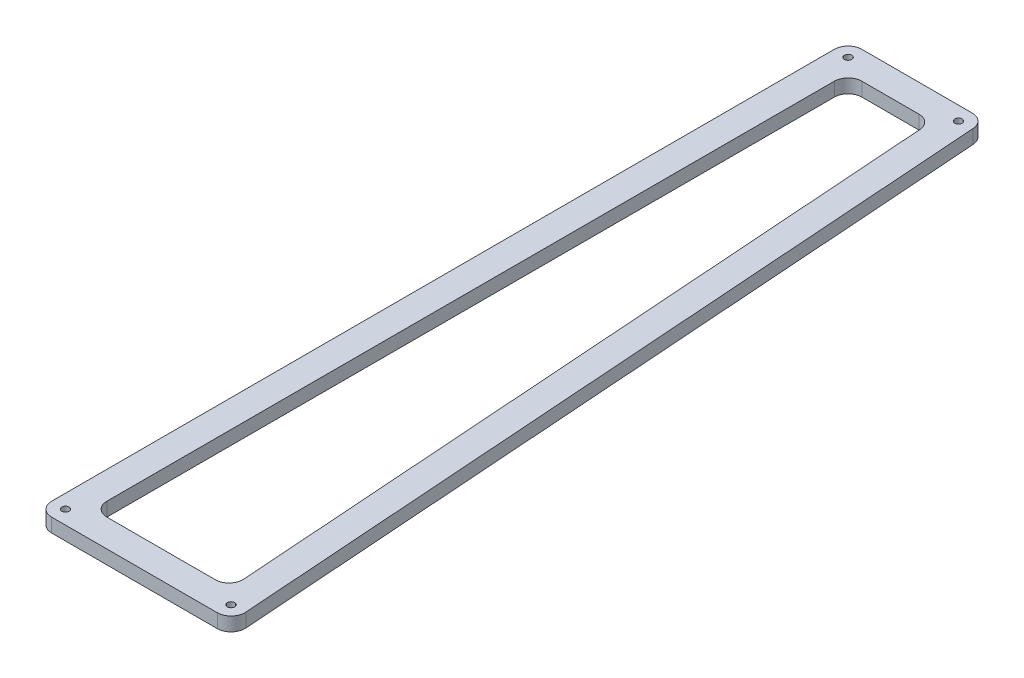
ISO-10303-21;
HEADER;
FILE_DESCRIPTION(('STEP AP214'),'2;1');
FILE_NAME('part.step','',(''),(''),'','','');
FILE_SCHEMA(('AUTOMOTIVE_DESIGN { 1 0 10303 214 1 1 1 1 }'));
ENDSEC;
DATA;
#1=APPLICATION_CONTEXT('core data for automotive mechanical design processes');
#2=APPLICATION_PROTOCOL_DEFINITION('international standard','automotive_design',2000,#1);
#3=PRODUCT_CONTEXT('',#1,'mechanical');
#4=PRODUCT('Part','Part','',(#3));
#5=PRODUCT_RELATED_PRODUCT_CATEGORY('part','',(#4));
#6=PRODUCT_DEFINITION_FORMATION('','',#4);
#7=PRODUCT_DEFINITION_CONTEXT('part definition',#1,'design');
#8=PRODUCT_DEFINITION('design','',#6,#7);
#9=PRODUCT_DEFINITION_SHAPE('','',#8);
#10=(LENGTH_UNIT() NAMED_UNIT(*) SI_UNIT(.MILLI.,.METRE.));
#11=(NAMED_UNIT(*) PLANE_ANGLE_UNIT() SI_UNIT($,.RADIAN.));
#12=(NAMED_UNIT(*) SI_UNIT($,.STERADIAN.) SOLID_ANGLE_UNIT());
#13=UNCERTAINTY_MEASURE_WITH_UNIT(LENGTH_MEASURE(1.E-05),#10,'distance_accuracy_value','');
#14=(GEOMETRIC_REPRESENTATION_CONTEXT(3) GLOBAL_UNCERTAINTY_ASSIGNED_CONTEXT((#13)) GLOBAL_UNIT_ASSIGNED_CONTEXT((#10,
#11,#12)) REPRESENTATION_CONTEXT('',''));
#15=CARTESIAN_POINT('',(0.,0.,0.));
#16=DIRECTION('',(0.,0.,1.));
#17=DIRECTION('',(1.,0.,0.));
#18=AXIS2_PLACEMENT_3D('',#15,#16,#17);
#19=CARTESIAN_POINT('',(0.,3.175,0.));
#20=DIRECTION('',(0.,1.,0.));
#21=DIRECTION('',(0.,0.,1.));
#22=AXIS2_PLACEMENT_3D('',#19,#20,#21);
#23=PLANE('',#22);
#24=CARTESIAN_POINT('',(38.1,3.175,0.));
#25=DIRECTION('',(0.,1.,0.));
#26=DIRECTION('',(0.,0.,1.));
#27=AXIS2_PLACEMENT_3D('',#24,#25,#26);
#28=CIRCLE('',#27,0.850899999999999);
#29=CARTESIAN_POINT('',(38.1,3.175,0.8509));
#30=VERTEX_POINT('',#29);
#31=EDGE_CURVE('E450',#30,#30,#28,.T.);
#32=ORIENTED_EDGE('',*,*,#31,.F.);
#33=EDGE_LOOP('',(#32));
#34=FACE_BOUND('',#33,.T.);
#35=CARTESIAN_POINT('',(0.,3.175,-180.086));
#36=DIRECTION('',(0.,1.,0.));
#37=DIRECTION('',(0.,0.,1.));
#38=AXIS2_PLACEMENT_3D('',#35,#36,#37);
#39=CIRCLE('',#38,0.850900000000004);
#40=CARTESIAN_POINT('',(0.,3.175,-179.2351));
#41=VERTEX_POINT('',#40);
#42=EDGE_CURVE('E207',#41,#41,#39,.T.);
#43=ORIENTED_EDGE('',*,*,#42,.F.);
#44=EDGE_LOOP('',(#43));
#45=FACE_BOUND('',#44,.T.);
#46=CARTESIAN_POINT('',(0.,3.175,0.));
#47=DIRECTION('',(0.,1.,0.));
#48=DIRECTION('',(0.,0.,1.));
#49=AXIS2_PLACEMENT_3D('',#46,#47,#48);
#50=CIRCLE('',#49,3.175);
#51=CARTESIAN_POINT('',(-3.17499999999998,3.175,0.));
#52=VERTEX_POINT('',#51);
#53=CARTESIAN_POINT('',(0.,3.175,3.175));
#54=VERTEX_POINT('',#53);
#55=EDGE_CURVE('E251',#52,#54,#50,.T.);
#56=ORIENTED_EDGE('',*,*,#55,.T.);
#57=DIRECTION('',(1.,0.,0.));
#58=VECTOR('',#57,1.);
#59=CARTESIAN_POINT('',(0.,3.175,3.175));
#60=LINE('',#59,#58);
#61=CARTESIAN_POINT('',(38.1,3.175,3.17500000000001));
#62=VERTEX_POINT('',#61);
#63=EDGE_CURVE('E255',#54,#62,#60,.T.);
#64=ORIENTED_EDGE('',*,*,#63,.T.);
#65=CARTESIAN_POINT('',(38.1,3.175,0.));
#66=DIRECTION('',(0.,1.,0.));
#67=DIRECTION('',(0.,0.,1.));
#68=AXIS2_PLACEMENT_3D('',#65,#66,#67);
#69=CIRCLE('',#68,3.17500000000001);
#70=CARTESIAN_POINT('',(41.2671341613275,3.175,-0.223352197554828));
#71=VERTEX_POINT('',#70);
#72=EDGE_CURVE('E259',#62,#71,#69,.T.);
#73=ORIENTED_EDGE('',*,*,#72,.T.);
#74=DIRECTION('',(-0.0703471488361664,0.,-0.997522570496839));
#75=VECTOR('',#74,1.);
#76=CARTESIAN_POINT('',(41.2671341613275,3.175,-0.223352197554828));
#77=LINE('',#76,#75);
#78=CARTESIAN_POINT('',(28.5671341613275,3.175,-180.309352197555));
#79=VERTEX_POINT('',#78);
#80=EDGE_CURVE('E262',#71,#79,#77,.T.);
#81=ORIENTED_EDGE('',*,*,#80,.T.);
#82=CARTESIAN_POINT('',(25.4,3.175,-180.086));
#83=DIRECTION('',(0.,1.,0.));
#84=DIRECTION('',(0.,0.,1.));
#85=AXIS2_PLACEMENT_3D('',#82,#83,#84);
#86=CIRCLE('',#85,3.17499999999999);
#87=CARTESIAN_POINT('',(25.4,3.175,-183.261));
#88=VERTEX_POINT('',#87);
#89=EDGE_CURVE('E265',#79,#88,#86,.T.);
#90=ORIENTED_EDGE('',*,*,#89,.T.);
#91=DIRECTION('',(-1.,0.,0.));
#92=VECTOR('',#91,1.);
#93=CARTESIAN_POINT('',(25.4,3.175,-183.261));
#94=LINE('',#93,#92);
#95=CARTESIAN_POINT('',(0.,3.175,-183.261));
#96=VERTEX_POINT('',#95);
#97=EDGE_CURVE('E268',#88,#96,#94,.T.);
#98=ORIENTED_EDGE('',*,*,#97,.T.);
#99=CARTESIAN_POINT('',(0.,3.175,-180.086));
#100=DIRECTION('',(0.,1.,0.));
#101=DIRECTION('',(0.,0.,-1.));
#102=AXIS2_PLACEMENT_3D('',#99,#100,#101);
#103=CIRCLE('',#102,3.17500000000001);
#104=CARTESIAN_POINT('',(-3.175,3.175,-180.086));
#105=VERTEX_POINT('',#104);
#106=EDGE_CURVE('E271',#96,#105,#103,.T.);
#107=ORIENTED_EDGE('',*,*,#106,.T.);
#108=DIRECTION('',(0.,0.,1.));
#109=VECTOR('',#108,1.);
#110=CARTESIAN_POINT('',(-3.175,3.175,-180.086));
#111=LINE('',#110,#109);
#112=EDGE_CURVE('E274',#105,#52,#111,.T.);
#113=ORIENTED_EDGE('',*,*,#112,.T.);
#114=EDGE_LOOP('',(#56,#64,#73,#81,#90,#98,#107,#113));
#115=FACE_BOUND('',#114,.T.);
#116=DIRECTION('',(1.,0.,0.));
#117=VECTOR('',#116,1.);
#118=CARTESIAN_POINT('',(6.35000000000008,3.175,-3.175));
#119=LINE('',#118,#117);
#120=CARTESIAN_POINT('',(6.35000000000008,3.175,-3.175));
#121=VERTEX_POINT('',#120);
#122=CARTESIAN_POINT('',(31.286415429453,3.175,-3.175));
#123=VERTEX_POINT('',#122);
#124=EDGE_CURVE('E168',#121,#123,#119,.T.);
#125=ORIENTED_EDGE('',*,*,#124,.F.);
#126=CARTESIAN_POINT('',(6.35000000000005,3.175,-6.35));
#127=DIRECTION('',(0.,1.,0.));
#128=DIRECTION('',(0.,0.,1.));
#129=AXIS2_PLACEMENT_3D('',#126,#127,#128);
#130=CIRCLE('',#129,3.175);
#131=CARTESIAN_POINT('',(3.17500000000005,3.175,-6.35000000000002));
#132=VERTEX_POINT('',#131);
#133=EDGE_CURVE('E159',#132,#121,#130,.T.);
#134=ORIENTED_EDGE('',*,*,#133,.F.);
#135=DIRECTION('',(0.,0.,1.));
#136=VECTOR('',#135,1.);
#137=CARTESIAN_POINT('',(3.175,3.175,-173.736));
#138=LINE('',#137,#136);
#139=CARTESIAN_POINT('',(3.175,3.175,-173.736));
#140=VERTEX_POINT('',#139);
#141=EDGE_CURVE('E202',#140,#132,#138,.T.);
#142=ORIENTED_EDGE('',*,*,#141,.F.);
#143=CARTESIAN_POINT('',(6.35,3.175,-173.736));
#144=DIRECTION('',(0.,1.,0.));
#145=DIRECTION('',(0.,0.,-1.));
#146=AXIS2_PLACEMENT_3D('',#143,#144,#145);
#147=CIRCLE('',#146,3.17500000000001);
#148=CARTESIAN_POINT('',(6.35,3.175,-176.911));
#149=VERTEX_POINT('',#148);
#150=EDGE_CURVE('E199',#149,#140,#147,.T.);
#151=ORIENTED_EDGE('',*,*,#150,.F.);
#152=DIRECTION('',(-1.,0.,0.));
#153=VECTOR('',#152,1.);
#154=CARTESIAN_POINT('',(19.4820430740228,3.175,-176.911));
#155=LINE('',#154,#153);
#156=CARTESIAN_POINT('',(19.4820430740228,3.175,-176.911));
#157=VERTEX_POINT('',#156);
#158=EDGE_CURVE('E196',#157,#149,#155,.T.);
#159=ORIENTED_EDGE('',*,*,#158,.F.);
#160=CARTESIAN_POINT('',(19.4820430740228,3.175,-173.736));
#161=DIRECTION('',(0.,1.,0.));
#162=DIRECTION('',(0.,0.,1.));
#163=AXIS2_PLACEMENT_3D('',#160,#161,#162);
#164=CIRCLE('',#163,3.175);
#165=CARTESIAN_POINT('',(22.6491772353503,3.175,-173.959352197555));
#166=VERTEX_POINT('',#165);
#167=EDGE_CURVE('E193',#166,#157,#164,.T.);
#168=ORIENTED_EDGE('',*,*,#167,.F.);
#169=DIRECTION('',(-0.0703471488361663,0.,-0.99752257049684));
#170=VECTOR('',#169,1.);
#171=CARTESIAN_POINT('',(34.4535495907805,3.175,-6.57335219755483));
#172=LINE('',#171,#170);
#173=CARTESIAN_POINT('',(34.4535495907805,3.175,-6.57335219755483));
#174=VERTEX_POINT('',#173);
#175=EDGE_CURVE('E187',#174,#166,#172,.T.);
#176=ORIENTED_EDGE('',*,*,#175,.F.);
#177=CARTESIAN_POINT('',(31.286415429453,3.175,-6.35));
#178=DIRECTION('',(0.,1.,0.));
#179=DIRECTION('',(0.,0.,1.));
#180=AXIS2_PLACEMENT_3D('',#177,#178,#179);
#181=CIRCLE('',#180,3.175);
#182=EDGE_CURVE('E183',#123,#174,#181,.T.);
#183=ORIENTED_EDGE('',*,*,#182,.F.);
#184=EDGE_LOOP('',(#125,#134,#142,#151,#159,#168,#176,#183));
#185=FACE_BOUND('',#184,.T.);
#186=CARTESIAN_POINT('',(25.4,3.175,-180.086));
#187=DIRECTION('',(0.,1.,0.));
#188=DIRECTION('',(0.,0.,1.));
#189=AXIS2_PLACEMENT_3D('',#186,#187,#188);
#190=CIRCLE('',#189,0.850900000000006);
#191=CARTESIAN_POINT('',(25.4,3.175,-179.2351));
#192=VERTEX_POINT('',#191);
#193=EDGE_CURVE('E458',#192,#192,#190,.T.);
#194=ORIENTED_EDGE('',*,*,#193,.F.);
#195=EDGE_LOOP('',(#194));
#196=FACE_BOUND('',#195,.T.);
#197=CARTESIAN_POINT('',(0.,3.175,0.));
#198=DIRECTION('',(0.,1.,0.));
#199=DIRECTION('',(0.,0.,1.));
#200=AXIS2_PLACEMENT_3D('',#197,#198,#199);
#201=CIRCLE('',#200,0.8509);
#202=CARTESIAN_POINT('',(0.,3.175,0.850900000000001));
#203=VERTEX_POINT('',#202);
#204=EDGE_CURVE('E439',#203,#203,#201,.T.);
#205=ORIENTED_EDGE('',*,*,#204,.F.);
#206=EDGE_LOOP('',(#205));
#207=FACE_BOUND('',#206,.T.);
#208=ADVANCED_FACE('F45',(#34,#45,#115,#185,#196,#207),#23,.T.);
#209=CARTESIAN_POINT('',(0.,0.,0.));
#210=DIRECTION('',(0.,1.,0.));
#211=DIRECTION('',(0.,0.,1.));
#212=AXIS2_PLACEMENT_3D('',#209,#210,#211);
#213=PLANE('',#212);
#214=CARTESIAN_POINT('',(0.,0.,0.));
#215=DIRECTION('',(0.,1.,0.));
#216=DIRECTION('',(0.,0.,1.));
#217=AXIS2_PLACEMENT_3D('',#214,#215,#216);
#218=CIRCLE('',#217,3.175);
#219=CARTESIAN_POINT('',(-3.17499999999998,0.,0.));
#220=VERTEX_POINT('',#219);
#221=CARTESIAN_POINT('',(0.,0.,3.175));
#222=VERTEX_POINT('',#221);
#223=EDGE_CURVE('E177',#220,#222,#218,.T.);
#224=ORIENTED_EDGE('',*,*,#223,.F.);
#225=DIRECTION('',(0.,0.,1.));
#226=VECTOR('',#225,1.);
#227=CARTESIAN_POINT('',(-3.175,0.,-180.086));
#228=LINE('',#227,#226);
#229=CARTESIAN_POINT('',(-3.175,0.,-180.086));
#230=VERTEX_POINT('',#229);
#231=EDGE_CURVE('E256',#230,#220,#228,.T.);
#232=ORIENTED_EDGE('',*,*,#231,.F.);
#233=CARTESIAN_POINT('',(0.,0.,-180.086));
#234=DIRECTION('',(0.,1.,0.));
#235=DIRECTION('',(0.,0.,-1.));
#236=AXIS2_PLACEMENT_3D('',#233,#234,#235);
#237=CIRCLE('',#236,3.17500000000001);
#238=CARTESIAN_POINT('',(0.,0.,-183.261));
#239=VERTEX_POINT('',#238);
#240=EDGE_CURVE('E296',#239,#230,#237,.T.);
#241=ORIENTED_EDGE('',*,*,#240,.F.);
#242=DIRECTION('',(-1.,0.,0.));
#243=VECTOR('',#242,1.);
#244=CARTESIAN_POINT('',(25.4,0.,-183.261));
#245=LINE('',#244,#243);
#246=CARTESIAN_POINT('',(25.4,0.,-183.261));
#247=VERTEX_POINT('',#246);
#248=EDGE_CURVE('E293',#247,#239,#245,.T.);
#249=ORIENTED_EDGE('',*,*,#248,.F.);
#250=CARTESIAN_POINT('',(25.4,0.,-180.086));
#251=DIRECTION('',(0.,1.,0.));
#252=DIRECTION('',(0.,0.,1.));
#253=AXIS2_PLACEMENT_3D('',#250,#251,#252);
#254=CIRCLE('',#253,3.17499999999999);
#255=CARTESIAN_POINT('',(28.5671341613275,0.,-180.309352197555));
#256=VERTEX_POINT('',#255);
#257=EDGE_CURVE('E290',#256,#247,#254,.T.);
#258=ORIENTED_EDGE('',*,*,#257,.F.);
#259=DIRECTION('',(-0.0703471488361664,0.,-0.997522570496839));
#260=VECTOR('',#259,1.);
#261=CARTESIAN_POINT('',(41.2671341613275,0.,-0.223352197554828));
#262=LINE('',#261,#260);
#263=CARTESIAN_POINT('',(41.2671341613275,0.,-0.223352197554828));
#264=VERTEX_POINT('',#263);
#265=EDGE_CURVE('E287',#264,#256,#262,.T.);
#266=ORIENTED_EDGE('',*,*,#265,.F.);
#267=CARTESIAN_POINT('',(38.1,0.,0.));
#268=DIRECTION('',(0.,1.,0.));
#269=DIRECTION('',(0.,0.,1.));
#270=AXIS2_PLACEMENT_3D('',#267,#268,#269);
#271=CIRCLE('',#270,3.17500000000001);
#272=CARTESIAN_POINT('',(38.1,0.,3.17500000000001));
#273=VERTEX_POINT('',#272);
#274=EDGE_CURVE('E284',#273,#264,#271,.T.);
#275=ORIENTED_EDGE('',*,*,#274,.F.);
#276=DIRECTION('',(1.,0.,0.));
#277=VECTOR('',#276,1.);
#278=CARTESIAN_POINT('',(0.,0.,3.175));
#279=LINE('',#278,#277);
#280=EDGE_CURVE('E281',#222,#273,#279,.T.);
#281=ORIENTED_EDGE('',*,*,#280,.F.);
#282=EDGE_LOOP('',(#224,#232,#241,#249,#258,#266,#275,#281));
#283=FACE_BOUND('',#282,.T.);
#284=CARTESIAN_POINT('',(6.35000000000005,0.,-6.35));
#285=DIRECTION('',(0.,1.,0.));
#286=DIRECTION('',(0.,0.,1.));
#287=AXIS2_PLACEMENT_3D('',#284,#285,#286);
#288=CIRCLE('',#287,3.175);
#289=CARTESIAN_POINT('',(3.17500000000005,0.,-6.35000000000002));
#290=VERTEX_POINT('',#289);
#291=CARTESIAN_POINT('',(6.35000000000008,0.,-3.175));
#292=VERTEX_POINT('',#291);
#293=EDGE_CURVE('E69',#290,#292,#288,.T.);
#294=ORIENTED_EDGE('',*,*,#293,.T.);
#295=DIRECTION('',(1.,0.,0.));
#296=VECTOR('',#295,1.);
#297=CARTESIAN_POINT('',(6.35000000000008,0.,-3.175));
#298=LINE('',#297,#296);
#299=CARTESIAN_POINT('',(31.286415429453,0.,-3.175));
#300=VERTEX_POINT('',#299);
#301=EDGE_CURVE('E175',#292,#300,#298,.T.);
#302=ORIENTED_EDGE('',*,*,#301,.T.);
#303=CARTESIAN_POINT('',(31.286415429453,0.,-6.35));
#304=DIRECTION('',(0.,1.,0.));
#305=DIRECTION('',(0.,0.,1.));
#306=AXIS2_PLACEMENT_3D('',#303,#304,#305);
#307=CIRCLE('',#306,3.175);
#308=CARTESIAN_POINT('',(34.4535495907805,0.,-6.57335219755483));
#309=VERTEX_POINT('',#308);
#310=EDGE_CURVE('E210',#300,#309,#307,.T.);
#311=ORIENTED_EDGE('',*,*,#310,.T.);
#312=DIRECTION('',(-0.0703471488361663,0.,-0.99752257049684));
#313=VECTOR('',#312,1.);
#314=CARTESIAN_POINT('',(34.4535495907805,0.,-6.57335219755483));
#315=LINE('',#314,#313);
#316=CARTESIAN_POINT('',(22.6491772353503,0.,-173.959352197555));
#317=VERTEX_POINT('',#316);
#318=EDGE_CURVE('E214',#309,#317,#315,.T.);
#319=ORIENTED_EDGE('',*,*,#318,.T.);
#320=CARTESIAN_POINT('',(19.4820430740228,0.,-173.736));
#321=DIRECTION('',(0.,1.,0.));
#322=DIRECTION('',(0.,0.,1.));
#323=AXIS2_PLACEMENT_3D('',#320,#321,#322);
#324=CIRCLE('',#323,3.175);
#325=CARTESIAN_POINT('',(19.4820430740228,0.,-176.911));
#326=VERTEX_POINT('',#325);
#327=EDGE_CURVE('E218',#317,#326,#324,.T.);
#328=ORIENTED_EDGE('',*,*,#327,.T.);
#329=DIRECTION('',(-1.,0.,0.));
#330=VECTOR('',#329,1.);
#331=CARTESIAN_POINT('',(19.4820430740228,0.,-176.911));
#332=LINE('',#331,#330);
#333=CARTESIAN_POINT('',(6.35,0.,-176.911));
#334=VERTEX_POINT('',#333);
#335=EDGE_CURVE('E222',#326,#334,#332,.T.);
#336=ORIENTED_EDGE('',*,*,#335,.T.);
#337=CARTESIAN_POINT('',(6.35,0.,-173.736));
#338=DIRECTION('',(0.,1.,0.));
#339=DIRECTION('',(0.,0.,-1.));
#340=AXIS2_PLACEMENT_3D('',#337,#338,#339);
#341=CIRCLE('',#340,3.17500000000001);
#342=CARTESIAN_POINT('',(3.175,0.,-173.736));
#343=VERTEX_POINT('',#342);
#344=EDGE_CURVE('E226',#334,#343,#341,.T.);
#345=ORIENTED_EDGE('',*,*,#344,.T.);
#346=DIRECTION('',(0.,0.,1.));
#347=VECTOR('',#346,1.);
#348=CARTESIAN_POINT('',(3.175,0.,-173.736));
#349=LINE('',#348,#347);
#350=EDGE_CURVE('E169',#343,#290,#349,.T.);
#351=ORIENTED_EDGE('',*,*,#350,.T.);
#352=EDGE_LOOP('',(#294,#302,#311,#319,#328,#336,#345,#351));
#353=FACE_BOUND('',#352,.T.);
#354=CARTESIAN_POINT('',(0.,0.,-180.086));
#355=DIRECTION('',(0.,1.,0.));
#356=DIRECTION('',(0.,0.,1.));
#357=AXIS2_PLACEMENT_3D('',#354,#355,#356);
#358=CIRCLE('',#357,0.850900000000004);
#359=CARTESIAN_POINT('',(0.,0.,-179.2351));
#360=VERTEX_POINT('',#359);
#361=EDGE_CURVE('E462',#360,#360,#358,.T.);
#362=ORIENTED_EDGE('',*,*,#361,.T.);
#363=EDGE_LOOP('',(#362));
#364=FACE_BOUND('',#363,.T.);
#365=CARTESIAN_POINT('',(25.4,0.,-180.086));
#366=DIRECTION('',(0.,1.,0.));
#367=DIRECTION('',(0.,0.,1.));
#368=AXIS2_PLACEMENT_3D('',#365,#366,#367);
#369=CIRCLE('',#368,0.850900000000006);
#370=CARTESIAN_POINT('',(25.4,0.,-179.2351));
#371=VERTEX_POINT('',#370);
#372=EDGE_CURVE('E454',#371,#371,#369,.T.);
#373=ORIENTED_EDGE('',*,*,#372,.T.);
#374=EDGE_LOOP('',(#373));
#375=FACE_BOUND('',#374,.T.);
#376=CARTESIAN_POINT('',(38.1,0.,0.));
#377=DIRECTION('',(0.,1.,0.));
#378=DIRECTION('',(0.,0.,1.));
#379=AXIS2_PLACEMENT_3D('',#376,#377,#378);
#380=CIRCLE('',#379,0.850899999999999);
#381=CARTESIAN_POINT('',(38.1,0.,0.8509));
#382=VERTEX_POINT('',#381);
#383=EDGE_CURVE('E447',#382,#382,#380,.T.);
#384=ORIENTED_EDGE('',*,*,#383,.T.);
#385=EDGE_LOOP('',(#384));
#386=FACE_BOUND('',#385,.T.);
#387=CARTESIAN_POINT('',(0.,0.,0.));
#388=DIRECTION('',(0.,1.,0.));
#389=DIRECTION('',(0.,0.,1.));
#390=AXIS2_PLACEMENT_3D('',#387,#388,#389);
#391=CIRCLE('',#390,0.8509);
#392=CARTESIAN_POINT('',(0.,0.,0.850900000000001));
#393=VERTEX_POINT('',#392);
#394=EDGE_CURVE('E442',#393,#393,#391,.T.);
#395=ORIENTED_EDGE('',*,*,#394,.T.);
#396=EDGE_LOOP('',(#395));
#397=FACE_BOUND('',#396,.T.);
#398=ADVANCED_FACE('F335',(#283,#353,#364,#375,#386,#397),#213,.F.);
#399=CARTESIAN_POINT('',(0.,3.175,0.));
#400=DIRECTION('',(0.,-1.,0.));
#401=DIRECTION('',(0.,0.,-1.));
#402=AXIS2_PLACEMENT_3D('',#399,#400,#401);
#403=CYLINDRICAL_SURFACE('',#402,3.175);
#404=ORIENTED_EDGE('',*,*,#223,.T.);
#405=DIRECTION('',(0.,-1.,0.));
#406=VECTOR('',#405,1.);
#407=CARTESIAN_POINT('',(0.,3.175,3.175));
#408=LINE('',#407,#406);
#409=EDGE_CURVE('E11',#54,#222,#408,.T.);
#410=ORIENTED_EDGE('',*,*,#409,.F.);
#411=ORIENTED_EDGE('',*,*,#55,.F.);
#412=DIRECTION('',(0.,-1.,0.));
#413=VECTOR('',#412,1.);
#414=CARTESIAN_POINT('',(-3.17499999999998,3.175,0.));
#415=LINE('',#414,#413);
#416=EDGE_CURVE('E277',#52,#220,#415,.T.);
#417=ORIENTED_EDGE('',*,*,#416,.T.);
#418=EDGE_LOOP('',(#404,#410,#411,#417));
#419=FACE_BOUND('',#418,.T.);
#420=ADVANCED_FACE('F47',(#419),#403,.T.);
#421=CARTESIAN_POINT('',(0.,3.175,3.175));
#422=DIRECTION('',(0.,0.,-1.));
#423=DIRECTION('',(-1.,0.,0.));
#424=AXIS2_PLACEMENT_3D('',#421,#422,#423);
#425=PLANE('',#424);
#426=ORIENTED_EDGE('',*,*,#280,.T.);
#427=DIRECTION('',(0.,-1.,0.));
#428=VECTOR('',#427,1.);
#429=CARTESIAN_POINT('',(38.1,3.175,3.17500000000001));
#430=LINE('',#429,#428);
#431=EDGE_CURVE('E54',#62,#273,#430,.T.);
#432=ORIENTED_EDGE('',*,*,#431,.F.);
#433=ORIENTED_EDGE('',*,*,#63,.F.);
#434=ORIENTED_EDGE('',*,*,#409,.T.);
#435=EDGE_LOOP('',(#426,#432,#433,#434));
#436=FACE_BOUND('',#435,.T.);
#437=ADVANCED_FACE('F352',(#436),#425,.F.);
#438=CARTESIAN_POINT('',(38.1,3.175,0.));
#439=DIRECTION('',(0.,-1.,0.));
#440=DIRECTION('',(0.,0.,-1.));
#441=AXIS2_PLACEMENT_3D('',#438,#439,#440);
#442=CYLINDRICAL_SURFACE('',#441,3.17500000000001);
#443=ORIENTED_EDGE('',*,*,#274,.T.);
#444=DIRECTION('',(0.,-1.,0.));
#445=VECTOR('',#444,1.);
#446=CARTESIAN_POINT('',(41.2671341613275,3.175,-0.223352197554828));
#447=LINE('',#446,#445);
#448=EDGE_CURVE('E320',#71,#264,#447,.T.);
#449=ORIENTED_EDGE('',*,*,#448,.F.);
#450=ORIENTED_EDGE('',*,*,#72,.F.);
#451=ORIENTED_EDGE('',*,*,#431,.T.);
#452=EDGE_LOOP('',(#443,#449,#450,#451));
#453=FACE_BOUND('',#452,.T.);
#454=ADVANCED_FACE('F329',(#453),#442,.T.);
#455=CARTESIAN_POINT('',(41.2671341613275,3.175,-0.223352197554828));
#456=DIRECTION('',(-0.997522570496839,0.,0.0703471488361664));
#457=DIRECTION('',(0.0703471488361664,0.,0.99752257049684));
#458=AXIS2_PLACEMENT_3D('',#455,#456,#457);
#459=PLANE('',#458);
#460=ORIENTED_EDGE('',*,*,#265,.T.);
#461=DIRECTION('',(0.,-1.,0.));
#462=VECTOR('',#461,1.);
#463=CARTESIAN_POINT('',(28.5671341613275,3.175,-180.309352197555));
#464=LINE('',#463,#462);
#465=EDGE_CURVE('E316',#79,#256,#464,.T.);
#466=ORIENTED_EDGE('',*,*,#465,.F.);
#467=ORIENTED_EDGE('',*,*,#80,.F.);
#468=ORIENTED_EDGE('',*,*,#448,.T.);
#469=EDGE_LOOP('',(#460,#466,#467,#468));
#470=FACE_BOUND('',#469,.T.);
#471=ADVANCED_FACE('F341',(#470),#459,.F.);
#472=CARTESIAN_POINT('',(25.4,3.175,-180.086));
#473=DIRECTION('',(0.,-1.,0.));
#474=DIRECTION('',(0.,0.,-1.));
#475=AXIS2_PLACEMENT_3D('',#472,#473,#474);
#476=CYLINDRICAL_SURFACE('',#475,3.17499999999999);
#477=ORIENTED_EDGE('',*,*,#257,.T.);
#478=DIRECTION('',(0.,-1.,0.));
#479=VECTOR('',#478,1.);
#480=CARTESIAN_POINT('',(25.4,3.175,-183.261));
#481=LINE('',#480,#479);
#482=EDGE_CURVE('E312',#88,#247,#481,.T.);
#483=ORIENTED_EDGE('',*,*,#482,.F.);
#484=ORIENTED_EDGE('',*,*,#89,.F.);
#485=ORIENTED_EDGE('',*,*,#465,.T.);
#486=EDGE_LOOP('',(#477,#483,#484,#485));
#487=FACE_BOUND('',#486,.T.);
#488=ADVANCED_FACE('F345',(#487),#476,.T.);
#489=CARTESIAN_POINT('',(25.4,3.175,-183.261));
#490=DIRECTION('',(0.,0.,1.));
#491=DIRECTION('',(1.,0.,0.));
#492=AXIS2_PLACEMENT_3D('',#489,#490,#491);
#493=PLANE('',#492);
#494=ORIENTED_EDGE('',*,*,#248,.T.);
#495=DIRECTION('',(0.,-1.,0.));
#496=VECTOR('',#495,1.);
#497=CARTESIAN_POINT('',(0.,3.175,-183.261));
#498=LINE('',#497,#496);
#499=EDGE_CURVE('E308',#96,#239,#498,.T.);
#500=ORIENTED_EDGE('',*,*,#499,.F.);
#501=ORIENTED_EDGE('',*,*,#97,.F.);
#502=ORIENTED_EDGE('',*,*,#482,.T.);
#503=EDGE_LOOP('',(#494,#500,#501,#502));
#504=FACE_BOUND('',#503,.T.);
#505=ADVANCED_FACE('F365',(#504),#493,.F.);
#506=CARTESIAN_POINT('',(0.,3.175,-180.086));
#507=DIRECTION('',(0.,-1.,0.));
#508=DIRECTION('',(0.,0.,-1.));
#509=AXIS2_PLACEMENT_3D('',#506,#507,#508);
#510=CYLINDRICAL_SURFACE('',#509,3.17500000000001);
#511=ORIENTED_EDGE('',*,*,#240,.T.);
#512=DIRECTION('',(0.,-1.,0.));
#513=VECTOR('',#512,1.);
#514=CARTESIAN_POINT('',(-3.175,3.175,-180.086));
#515=LINE('',#514,#513);
#516=EDGE_CURVE('E304',#105,#230,#515,.T.);
#517=ORIENTED_EDGE('',*,*,#516,.F.);
#518=ORIENTED_EDGE('',*,*,#106,.F.);
#519=ORIENTED_EDGE('',*,*,#499,.T.);
#520=EDGE_LOOP('',(#511,#517,#518,#519));
#521=FACE_BOUND('',#520,.T.);
#522=ADVANCED_FACE('F363',(#521),#510,.T.);
#523=CARTESIAN_POINT('',(-3.175,3.175,-180.086));
#524=DIRECTION('',(1.,0.,0.));
#525=DIRECTION('',(0.,0.,-1.));
#526=AXIS2_PLACEMENT_3D('',#523,#524,#525);
#527=PLANE('',#526);
#528=ORIENTED_EDGE('',*,*,#231,.T.);
#529=ORIENTED_EDGE('',*,*,#416,.F.);
#530=ORIENTED_EDGE('',*,*,#112,.F.);
#531=ORIENTED_EDGE('',*,*,#516,.T.);
#532=EDGE_LOOP('',(#528,#529,#530,#531));
#533=FACE_BOUND('',#532,.T.);
#534=ADVANCED_FACE('F358',(#533),#527,.F.);
#535=CARTESIAN_POINT('',(6.35000000000005,3.175,-6.35));
#536=DIRECTION('',(0.,-1.,0.));
#537=DIRECTION('',(0.,0.,-1.));
#538=AXIS2_PLACEMENT_3D('',#535,#536,#537);
#539=CYLINDRICAL_SURFACE('',#538,3.175);
#540=ORIENTED_EDGE('',*,*,#293,.F.);
#541=DIRECTION('',(0.,-1.,0.));
#542=VECTOR('',#541,1.);
#543=CARTESIAN_POINT('',(3.17500000000005,3.175,-6.35000000000002));
#544=LINE('',#543,#542);
#545=EDGE_CURVE('E163',#132,#290,#544,.T.);
#546=ORIENTED_EDGE('',*,*,#545,.F.);
#547=ORIENTED_EDGE('',*,*,#133,.T.);
#548=DIRECTION('',(0.,-1.,0.));
#549=VECTOR('',#548,1.);
#550=CARTESIAN_POINT('',(6.35000000000008,3.175,-3.175));
#551=LINE('',#550,#549);
#552=EDGE_CURVE('E162',#121,#292,#551,.T.);
#553=ORIENTED_EDGE('',*,*,#552,.T.);
#554=EDGE_LOOP('',(#540,#546,#547,#553));
#555=FACE_BOUND('',#554,.T.);
#556=ADVANCED_FACE('F161',(#555),#539,.F.);
#557=CARTESIAN_POINT('',(6.35000000000008,3.175,-3.175));
#558=DIRECTION('',(0.,0.,-1.));
#559=DIRECTION('',(-1.,0.,0.));
#560=AXIS2_PLACEMENT_3D('',#557,#558,#559);
#561=PLANE('',#560);
#562=ORIENTED_EDGE('',*,*,#301,.F.);
#563=ORIENTED_EDGE('',*,*,#552,.F.);
#564=ORIENTED_EDGE('',*,*,#124,.T.);
#565=DIRECTION('',(0.,-1.,0.));
#566=VECTOR('',#565,1.);
#567=CARTESIAN_POINT('',(31.286415429453,3.175,-3.175));
#568=LINE('',#567,#566);
#569=EDGE_CURVE('E178',#123,#300,#568,.T.);
#570=ORIENTED_EDGE('',*,*,#569,.T.);
#571=EDGE_LOOP('',(#562,#563,#564,#570));
#572=FACE_BOUND('',#571,.T.);
#573=ADVANCED_FACE('F172',(#572),#561,.T.);
#574=CARTESIAN_POINT('',(31.286415429453,3.175,-6.35));
#575=DIRECTION('',(0.,-1.,0.));
#576=DIRECTION('',(0.,0.,-1.));
#577=AXIS2_PLACEMENT_3D('',#574,#575,#576);
#578=CYLINDRICAL_SURFACE('',#577,3.175);
#579=ORIENTED_EDGE('',*,*,#310,.F.);
#580=ORIENTED_EDGE('',*,*,#569,.F.);
#581=ORIENTED_EDGE('',*,*,#182,.T.);
#582=DIRECTION('',(0.,-1.,0.));
#583=VECTOR('',#582,1.);
#584=CARTESIAN_POINT('',(34.4535495907805,3.175,-6.57335219755483));
#585=LINE('',#584,#583);
#586=EDGE_CURVE('E246',#174,#309,#585,.T.);
#587=ORIENTED_EDGE('',*,*,#586,.T.);
#588=EDGE_LOOP('',(#579,#580,#581,#587));
#589=FACE_BOUND('',#588,.T.);
#590=ADVANCED_FACE('F393',(#589),#578,.F.);
#591=CARTESIAN_POINT('',(34.4535495907805,3.175,-6.57335219755483));
#592=DIRECTION('',(-0.99752257049684,0.,0.0703471488361663));
#593=DIRECTION('',(0.0703471488361663,0.,0.99752257049684));
#594=AXIS2_PLACEMENT_3D('',#591,#592,#593);
#595=PLANE('',#594);
#596=ORIENTED_EDGE('',*,*,#318,.F.);
#597=ORIENTED_EDGE('',*,*,#586,.F.);
#598=ORIENTED_EDGE('',*,*,#175,.T.);
#599=DIRECTION('',(0.,-1.,0.));
#600=VECTOR('',#599,1.);
#601=CARTESIAN_POINT('',(22.6491772353503,3.175,-173.959352197555));
#602=LINE('',#601,#600);
#603=EDGE_CURVE('E243',#166,#317,#602,.T.);
#604=ORIENTED_EDGE('',*,*,#603,.T.);
#605=EDGE_LOOP('',(#596,#597,#598,#604));
#606=FACE_BOUND('',#605,.T.);
#607=ADVANCED_FACE('F397',(#606),#595,.T.);
#608=CARTESIAN_POINT('',(19.4820430740228,3.175,-173.736));
#609=DIRECTION('',(0.,-1.,0.));
#610=DIRECTION('',(0.,0.,-1.));
#611=AXIS2_PLACEMENT_3D('',#608,#609,#610);
#612=CYLINDRICAL_SURFACE('',#611,3.175);
#613=ORIENTED_EDGE('',*,*,#327,.F.);
#614=ORIENTED_EDGE('',*,*,#603,.F.);
#615=ORIENTED_EDGE('',*,*,#167,.T.);
#616=DIRECTION('',(0.,-1.,0.));
#617=VECTOR('',#616,1.);
#618=CARTESIAN_POINT('',(19.4820430740228,3.175,-176.911));
#619=LINE('',#618,#617);
#620=EDGE_CURVE('E240',#157,#326,#619,.T.);
#621=ORIENTED_EDGE('',*,*,#620,.T.);
#622=EDGE_LOOP('',(#613,#614,#615,#621));
#623=FACE_BOUND('',#622,.T.);
#624=ADVANCED_FACE('F403',(#623),#612,.F.);
#625=CARTESIAN_POINT('',(19.4820430740228,3.175,-176.911));
#626=DIRECTION('',(0.,0.,1.));
#627=DIRECTION('',(1.,0.,0.));
#628=AXIS2_PLACEMENT_3D('',#625,#626,#627);
#629=PLANE('',#628);
#630=ORIENTED_EDGE('',*,*,#335,.F.);
#631=ORIENTED_EDGE('',*,*,#620,.F.);
#632=ORIENTED_EDGE('',*,*,#158,.T.);
#633=DIRECTION('',(0.,-1.,0.));
#634=VECTOR('',#633,1.);
#635=CARTESIAN_POINT('',(6.35,3.175,-176.911));
#636=LINE('',#635,#634);
#637=EDGE_CURVE('E237',#149,#334,#636,.T.);
#638=ORIENTED_EDGE('',*,*,#637,.T.);
#639=EDGE_LOOP('',(#630,#631,#632,#638));
#640=FACE_BOUND('',#639,.T.);
#641=ADVANCED_FACE('F407',(#640),#629,.T.);
#642=CARTESIAN_POINT('',(6.35,3.175,-173.736));
#643=DIRECTION('',(0.,-1.,0.));
#644=DIRECTION('',(0.,0.,-1.));
#645=AXIS2_PLACEMENT_3D('',#642,#643,#644);
#646=CYLINDRICAL_SURFACE('',#645,3.17500000000001);
#647=ORIENTED_EDGE('',*,*,#344,.F.);
#648=ORIENTED_EDGE('',*,*,#637,.F.);
#649=ORIENTED_EDGE('',*,*,#150,.T.);
#650=DIRECTION('',(0.,-1.,0.));
#651=VECTOR('',#650,1.);
#652=CARTESIAN_POINT('',(3.175,3.175,-173.736));
#653=LINE('',#652,#651);
#654=EDGE_CURVE('E61',#140,#343,#653,.T.);
#655=ORIENTED_EDGE('',*,*,#654,.T.);
#656=EDGE_LOOP('',(#647,#648,#649,#655));
#657=FACE_BOUND('',#656,.T.);
#658=ADVANCED_FACE('F411',(#657),#646,.F.);
#659=CARTESIAN_POINT('',(3.175,3.175,-173.736));
#660=DIRECTION('',(1.,0.,0.));
#661=DIRECTION('',(0.,0.,-1.));
#662=AXIS2_PLACEMENT_3D('',#659,#660,#661);
#663=PLANE('',#662);
#664=ORIENTED_EDGE('',*,*,#350,.F.);
#665=ORIENTED_EDGE('',*,*,#654,.F.);
#666=ORIENTED_EDGE('',*,*,#141,.T.);
#667=ORIENTED_EDGE('',*,*,#545,.T.);
#668=EDGE_LOOP('',(#664,#665,#666,#667));
#669=FACE_BOUND('',#668,.T.);
#670=ADVANCED_FACE('F415',(#669),#663,.T.);
#671=CARTESIAN_POINT('',(0.,3.175,-180.086));
#672=DIRECTION('',(0.,-1.,0.));
#673=DIRECTION('',(0.,0.,-1.));
#674=AXIS2_PLACEMENT_3D('',#671,#672,#673);
#675=CYLINDRICAL_SURFACE('',#674,0.850900000000004);
#676=ORIENTED_EDGE('',*,*,#42,.T.);
#677=EDGE_LOOP('',(#676));
#678=FACE_BOUND('',#677,.T.);
#679=ORIENTED_EDGE('',*,*,#361,.F.);
#680=EDGE_LOOP('',(#679));
#681=FACE_BOUND('',#680,.T.);
#682=ADVANCED_FACE('F419',(#678,#681),#675,.F.);
#683=CARTESIAN_POINT('',(25.4,3.175,-180.086));
#684=DIRECTION('',(0.,-1.,0.));
#685=DIRECTION('',(0.,0.,-1.));
#686=AXIS2_PLACEMENT_3D('',#683,#684,#685);
#687=CYLINDRICAL_SURFACE('',#686,0.850900000000006);
#688=ORIENTED_EDGE('',*,*,#193,.T.);
#689=EDGE_LOOP('',(#688));
#690=FACE_BOUND('',#689,.T.);
#691=ORIENTED_EDGE('',*,*,#372,.F.);
#692=EDGE_LOOP('',(#691));
#693=FACE_BOUND('',#692,.T.);
#694=ADVANCED_FACE('F422',(#690,#693),#687,.F.);
#695=CARTESIAN_POINT('',(38.1,3.175,0.));
#696=DIRECTION('',(0.,-1.,0.));
#697=DIRECTION('',(0.,0.,-1.));
#698=AXIS2_PLACEMENT_3D('',#695,#696,#697);
#699=CYLINDRICAL_SURFACE('',#698,0.850899999999999);
#700=ORIENTED_EDGE('',*,*,#31,.T.);
#701=EDGE_LOOP('',(#700));
#702=FACE_BOUND('',#701,.T.);
#703=ORIENTED_EDGE('',*,*,#383,.F.);
#704=EDGE_LOOP('',(#703));
#705=FACE_BOUND('',#704,.T.);
#706=ADVANCED_FACE('F426',(#702,#705),#699,.F.);
#707=CARTESIAN_POINT('',(0.,3.175,0.));
#708=DIRECTION('',(0.,-1.,0.));
#709=DIRECTION('',(0.,0.,-1.));
#710=AXIS2_PLACEMENT_3D('',#707,#708,#709);
#711=CYLINDRICAL_SURFACE('',#710,0.8509);
#712=ORIENTED_EDGE('',*,*,#204,.T.);
#713=EDGE_LOOP('',(#712));
#714=FACE_BOUND('',#713,.T.);
#715=ORIENTED_EDGE('',*,*,#394,.F.);
#716=EDGE_LOOP('',(#715));
#717=FACE_BOUND('',#716,.T.);
#718=ADVANCED_FACE('F430',(#714,#717),#711,.F.);
#719=CLOSED_SHELL('',(#208,#398,#420,#437,#454,#471,#488,#505,#522,#534,#556,#573,#590,#607,
#624,#641,#658,#670,#682,#694,#706,#718));
#720=MANIFOLD_SOLID_BREP('B2',#719);
#721=ADVANCED_BREP_SHAPE_REPRESENTATION('',(#18,#720),#14);
#722=SHAPE_DEFINITION_REPRESENTATION(#9,#721);
ENDSEC;
END-ISO-10303-21;
